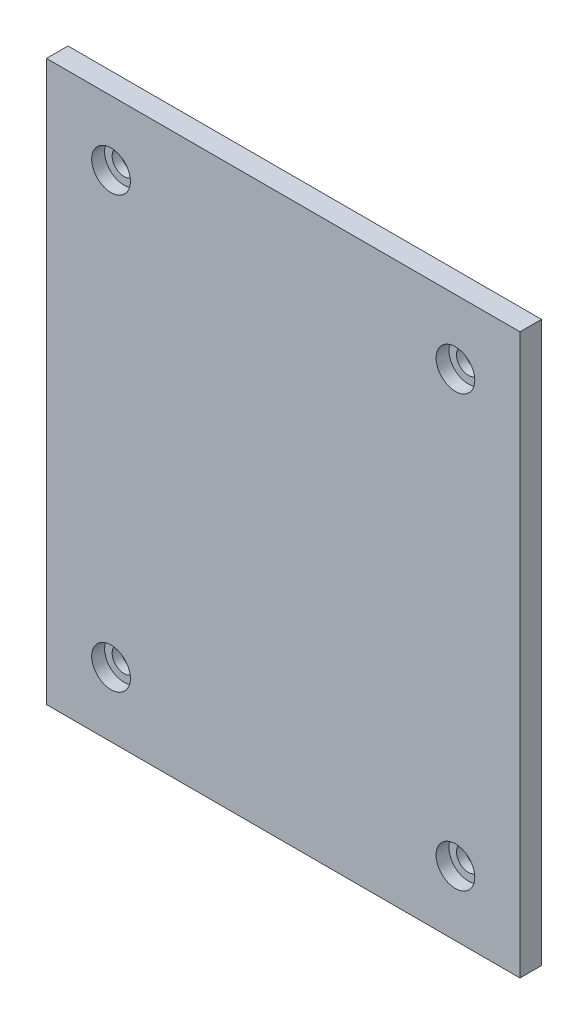
ISO-10303-21;
HEADER;
FILE_DESCRIPTION(('STEP AP214'),'2;1');
FILE_NAME('part.step','',(''),(''),'','','');
FILE_SCHEMA(('AUTOMOTIVE_DESIGN { 1 0 10303 214 1 1 1 1 }'));
ENDSEC;
DATA;
#1=APPLICATION_CONTEXT('core data for automotive mechanical design processes');
#2=APPLICATION_PROTOCOL_DEFINITION('international standard','automotive_design',2000,#1);
#3=PRODUCT_CONTEXT('',#1,'mechanical');
#4=PRODUCT('Part','Part','',(#3));
#5=PRODUCT_RELATED_PRODUCT_CATEGORY('part','',(#4));
#6=PRODUCT_DEFINITION_FORMATION('','',#4);
#7=PRODUCT_DEFINITION_CONTEXT('part definition',#1,'design');
#8=PRODUCT_DEFINITION('design','',#6,#7);
#9=PRODUCT_DEFINITION_SHAPE('','',#8);
#10=(LENGTH_UNIT() NAMED_UNIT(*) SI_UNIT(.MILLI.,.METRE.));
#11=(NAMED_UNIT(*) PLANE_ANGLE_UNIT() SI_UNIT($,.RADIAN.));
#12=(NAMED_UNIT(*) SI_UNIT($,.STERADIAN.) SOLID_ANGLE_UNIT());
#13=UNCERTAINTY_MEASURE_WITH_UNIT(LENGTH_MEASURE(1.E-05),#10,'distance_accuracy_value','');
#14=(GEOMETRIC_REPRESENTATION_CONTEXT(3) GLOBAL_UNCERTAINTY_ASSIGNED_CONTEXT((#13)) GLOBAL_UNIT_ASSIGNED_CONTEXT((#10,
#11,#12)) REPRESENTATION_CONTEXT('',''));
#15=CARTESIAN_POINT('',(0.,0.,0.));
#16=DIRECTION('',(0.,0.,1.));
#17=DIRECTION('',(1.,0.,0.));
#18=AXIS2_PLACEMENT_3D('',#15,#16,#17);
#19=CARTESIAN_POINT('',(-40.,50.,0.));
#20=DIRECTION('',(0.,0.,1.));
#21=DIRECTION('',(1.,0.,0.));
#22=AXIS2_PLACEMENT_3D('',#19,#20,#21);
#23=CYLINDRICAL_SURFACE('',#22,2.75);
#24=CARTESIAN_POINT('',(-40.,50.,0.));
#25=DIRECTION('',(0.,0.,1.));
#26=DIRECTION('',(1.,0.,0.));
#27=AXIS2_PLACEMENT_3D('',#24,#25,#26);
#28=CIRCLE('',#27,2.75);
#29=CARTESIAN_POINT('',(-37.25,50.,0.));
#30=VERTEX_POINT('',#29);
#31=EDGE_CURVE('E108',#30,#30,#28,.T.);
#32=ORIENTED_EDGE('',*,*,#31,.F.);
#33=EDGE_LOOP('',(#32));
#34=FACE_BOUND('',#33,.T.);
#35=CARTESIAN_POINT('',(-40.,50.,2.));
#36=DIRECTION('',(0.,0.,1.));
#37=DIRECTION('',(1.,0.,0.));
#38=AXIS2_PLACEMENT_3D('',#35,#36,#37);
#39=CIRCLE('',#38,2.75);
#40=CARTESIAN_POINT('',(-37.25,50.,2.));
#41=VERTEX_POINT('',#40);
#42=EDGE_CURVE('E43',#41,#41,#39,.F.);
#43=ORIENTED_EDGE('',*,*,#42,.F.);
#44=EDGE_LOOP('',(#43));
#45=FACE_BOUND('',#44,.T.);
#46=ADVANCED_FACE('F39',(#34,#45),#23,.F.);
#47=CARTESIAN_POINT('',(40.,-50.,0.));
#48=DIRECTION('',(0.,0.,1.));
#49=DIRECTION('',(1.,0.,0.));
#50=AXIS2_PLACEMENT_3D('',#47,#48,#49);
#51=CYLINDRICAL_SURFACE('',#50,2.75);
#52=CARTESIAN_POINT('',(40.,-50.,0.));
#53=DIRECTION('',(0.,0.,1.));
#54=DIRECTION('',(1.,0.,0.));
#55=AXIS2_PLACEMENT_3D('',#52,#53,#54);
#56=CIRCLE('',#55,2.75);
#57=CARTESIAN_POINT('',(42.75,-50.,0.));
#58=VERTEX_POINT('',#57);
#59=EDGE_CURVE('E133',#58,#58,#56,.T.);
#60=ORIENTED_EDGE('',*,*,#59,.F.);
#61=EDGE_LOOP('',(#60));
#62=FACE_BOUND('',#61,.T.);
#63=CARTESIAN_POINT('',(40.,-50.,2.));
#64=DIRECTION('',(0.,0.,1.));
#65=DIRECTION('',(1.,0.,0.));
#66=AXIS2_PLACEMENT_3D('',#63,#64,#65);
#67=CIRCLE('',#66,2.75);
#68=CARTESIAN_POINT('',(42.75,-50.,2.));
#69=VERTEX_POINT('',#68);
#70=EDGE_CURVE('E121',#69,#69,#67,.F.);
#71=ORIENTED_EDGE('',*,*,#70,.F.);
#72=EDGE_LOOP('',(#71));
#73=FACE_BOUND('',#72,.T.);
#74=ADVANCED_FACE('F193',(#62,#73),#51,.F.);
#75=CARTESIAN_POINT('',(-40.,-50.,0.));
#76=DIRECTION('',(0.,0.,1.));
#77=DIRECTION('',(1.,0.,0.));
#78=AXIS2_PLACEMENT_3D('',#75,#76,#77);
#79=CYLINDRICAL_SURFACE('',#78,2.75);
#80=CARTESIAN_POINT('',(-40.,-50.,0.));
#81=DIRECTION('',(0.,0.,1.));
#82=DIRECTION('',(1.,0.,0.));
#83=AXIS2_PLACEMENT_3D('',#80,#81,#82);
#84=CIRCLE('',#83,2.75);
#85=CARTESIAN_POINT('',(-37.25,-50.,0.));
#86=VERTEX_POINT('',#85);
#87=EDGE_CURVE('E128',#86,#86,#84,.T.);
#88=ORIENTED_EDGE('',*,*,#87,.F.);
#89=EDGE_LOOP('',(#88));
#90=FACE_BOUND('',#89,.T.);
#91=CARTESIAN_POINT('',(-40.,-50.,2.));
#92=DIRECTION('',(0.,0.,1.));
#93=DIRECTION('',(1.,0.,0.));
#94=AXIS2_PLACEMENT_3D('',#91,#92,#93);
#95=CIRCLE('',#94,2.75);
#96=CARTESIAN_POINT('',(-37.25,-50.,2.));
#97=VERTEX_POINT('',#96);
#98=EDGE_CURVE('E119',#97,#97,#95,.F.);
#99=ORIENTED_EDGE('',*,*,#98,.F.);
#100=EDGE_LOOP('',(#99));
#101=FACE_BOUND('',#100,.T.);
#102=ADVANCED_FACE('F203',(#90,#101),#79,.F.);
#103=CARTESIAN_POINT('',(40.,50.,0.));
#104=DIRECTION('',(0.,0.,1.));
#105=DIRECTION('',(1.,0.,0.));
#106=AXIS2_PLACEMENT_3D('',#103,#104,#105);
#107=CYLINDRICAL_SURFACE('',#106,2.75);
#108=CARTESIAN_POINT('',(40.,50.,0.));
#109=DIRECTION('',(0.,0.,1.));
#110=DIRECTION('',(1.,0.,0.));
#111=AXIS2_PLACEMENT_3D('',#108,#109,#110);
#112=CIRCLE('',#111,2.75);
#113=CARTESIAN_POINT('',(42.75,50.,0.));
#114=VERTEX_POINT('',#113);
#115=EDGE_CURVE('E127',#114,#114,#112,.T.);
#116=ORIENTED_EDGE('',*,*,#115,.F.);
#117=EDGE_LOOP('',(#116));
#118=FACE_BOUND('',#117,.T.);
#119=CARTESIAN_POINT('',(40.,50.,2.));
#120=DIRECTION('',(0.,0.,1.));
#121=DIRECTION('',(1.,0.,0.));
#122=AXIS2_PLACEMENT_3D('',#119,#120,#121);
#123=CIRCLE('',#122,2.75);
#124=CARTESIAN_POINT('',(42.75,50.,2.));
#125=VERTEX_POINT('',#124);
#126=EDGE_CURVE('E113',#125,#125,#123,.F.);
#127=ORIENTED_EDGE('',*,*,#126,.F.);
#128=EDGE_LOOP('',(#127));
#129=FACE_BOUND('',#128,.T.);
#130=ADVANCED_FACE('F202',(#118,#129),#107,.F.);
#131=CARTESIAN_POINT('',(-55.,-65.,5.));
#132=DIRECTION('',(0.,1.,0.));
#133=DIRECTION('',(-1.,0.,0.));
#134=AXIS2_PLACEMENT_3D('',#131,#132,#133);
#135=PLANE('',#134);
#136=DIRECTION('',(1.,0.,0.));
#137=VECTOR('',#136,1.);
#138=CARTESIAN_POINT('',(-55.,-65.,0.));
#139=LINE('',#138,#137);
#140=CARTESIAN_POINT('',(-55.,-65.,0.));
#141=VERTEX_POINT('',#140);
#142=CARTESIAN_POINT('',(55.,-65.,0.));
#143=VERTEX_POINT('',#142);
#144=EDGE_CURVE('E106',#141,#143,#139,.T.);
#145=ORIENTED_EDGE('',*,*,#144,.T.);
#146=DIRECTION('',(0.,0.,-1.));
#147=VECTOR('',#146,1.);
#148=CARTESIAN_POINT('',(55.,-65.,5.));
#149=LINE('',#148,#147);
#150=CARTESIAN_POINT('',(55.,-65.,5.));
#151=VERTEX_POINT('',#150);
#152=EDGE_CURVE('E11',#151,#143,#149,.T.);
#153=ORIENTED_EDGE('',*,*,#152,.F.);
#154=DIRECTION('',(1.,0.,0.));
#155=VECTOR('',#154,1.);
#156=CARTESIAN_POINT('',(-55.,-65.,5.));
#157=LINE('',#156,#155);
#158=CARTESIAN_POINT('',(-55.,-65.,5.));
#159=VERTEX_POINT('',#158);
#160=EDGE_CURVE('E91',#159,#151,#157,.T.);
#161=ORIENTED_EDGE('',*,*,#160,.F.);
#162=DIRECTION('',(0.,0.,-1.));
#163=VECTOR('',#162,1.);
#164=CARTESIAN_POINT('',(-55.,-65.,5.));
#165=LINE('',#164,#163);
#166=EDGE_CURVE('E105',#159,#141,#165,.T.);
#167=ORIENTED_EDGE('',*,*,#166,.T.);
#168=EDGE_LOOP('',(#145,#153,#161,#167));
#169=FACE_BOUND('',#168,.T.);
#170=ADVANCED_FACE('F41',(#169),#135,.F.);
#171=CARTESIAN_POINT('',(55.,65.,5.));
#172=DIRECTION('',(-1.,0.,0.));
#173=DIRECTION('',(0.,-1.,0.));
#174=AXIS2_PLACEMENT_3D('',#171,#172,#173);
#175=PLANE('',#174);
#176=DIRECTION('',(0.,1.,0.));
#177=VECTOR('',#176,1.);
#178=CARTESIAN_POINT('',(55.,65.,0.));
#179=LINE('',#178,#177);
#180=CARTESIAN_POINT('',(55.,65.,0.));
#181=VERTEX_POINT('',#180);
#182=EDGE_CURVE('E100',#143,#181,#179,.T.);
#183=ORIENTED_EDGE('',*,*,#182,.T.);
#184=DIRECTION('',(0.,0.,-1.));
#185=VECTOR('',#184,1.);
#186=CARTESIAN_POINT('',(55.,65.,5.));
#187=LINE('',#186,#185);
#188=CARTESIAN_POINT('',(55.,65.,5.));
#189=VERTEX_POINT('',#188);
#190=EDGE_CURVE('E47',#189,#181,#187,.T.);
#191=ORIENTED_EDGE('',*,*,#190,.F.);
#192=DIRECTION('',(0.,1.,0.));
#193=VECTOR('',#192,1.);
#194=CARTESIAN_POINT('',(55.,65.,5.));
#195=LINE('',#194,#193);
#196=EDGE_CURVE('E86',#151,#189,#195,.T.);
#197=ORIENTED_EDGE('',*,*,#196,.F.);
#198=ORIENTED_EDGE('',*,*,#152,.T.);
#199=EDGE_LOOP('',(#183,#191,#197,#198));
#200=FACE_BOUND('',#199,.T.);
#201=ADVANCED_FACE('F96',(#200),#175,.F.);
#202=CARTESIAN_POINT('',(-55.,65.,5.));
#203=DIRECTION('',(0.,-1.,0.));
#204=DIRECTION('',(0.,0.,-1.));
#205=AXIS2_PLACEMENT_3D('',#202,#203,#204);
#206=PLANE('',#205);
#207=DIRECTION('',(-1.,0.,0.));
#208=VECTOR('',#207,1.);
#209=CARTESIAN_POINT('',(-55.,65.,0.));
#210=LINE('',#209,#208);
#211=CARTESIAN_POINT('',(-55.,65.,0.));
#212=VERTEX_POINT('',#211);
#213=EDGE_CURVE('E73',#181,#212,#210,.T.);
#214=ORIENTED_EDGE('',*,*,#213,.T.);
#215=DIRECTION('',(0.,0.,-1.));
#216=VECTOR('',#215,1.);
#217=CARTESIAN_POINT('',(-55.,65.,5.));
#218=LINE('',#217,#216);
#219=CARTESIAN_POINT('',(-55.,65.,5.));
#220=VERTEX_POINT('',#219);
#221=EDGE_CURVE('E98',#220,#212,#218,.T.);
#222=ORIENTED_EDGE('',*,*,#221,.F.);
#223=DIRECTION('',(-1.,0.,0.));
#224=VECTOR('',#223,1.);
#225=CARTESIAN_POINT('',(-55.,65.,5.));
#226=LINE('',#225,#224);
#227=EDGE_CURVE('E93',#189,#220,#226,.T.);
#228=ORIENTED_EDGE('',*,*,#227,.F.);
#229=ORIENTED_EDGE('',*,*,#190,.T.);
#230=EDGE_LOOP('',(#214,#222,#228,#229));
#231=FACE_BOUND('',#230,.T.);
#232=ADVANCED_FACE('F99',(#231),#206,.F.);
#233=CARTESIAN_POINT('',(-55.,65.,5.));
#234=DIRECTION('',(1.,0.,0.));
#235=DIRECTION('',(0.,1.,0.));
#236=AXIS2_PLACEMENT_3D('',#233,#234,#235);
#237=PLANE('',#236);
#238=DIRECTION('',(0.,-1.,0.));
#239=VECTOR('',#238,1.);
#240=CARTESIAN_POINT('',(-55.,65.,0.));
#241=LINE('',#240,#239);
#242=EDGE_CURVE('E81',#212,#141,#241,.T.);
#243=ORIENTED_EDGE('',*,*,#242,.T.);
#244=ORIENTED_EDGE('',*,*,#166,.F.);
#245=DIRECTION('',(0.,-1.,0.));
#246=VECTOR('',#245,1.);
#247=CARTESIAN_POINT('',(-55.,65.,5.));
#248=LINE('',#247,#246);
#249=EDGE_CURVE('E59',#220,#159,#248,.T.);
#250=ORIENTED_EDGE('',*,*,#249,.F.);
#251=ORIENTED_EDGE('',*,*,#221,.T.);
#252=EDGE_LOOP('',(#243,#244,#250,#251));
#253=FACE_BOUND('',#252,.T.);
#254=ADVANCED_FACE('F173',(#253),#237,.F.);
#255=CARTESIAN_POINT('',(0.,0.,5.));
#256=DIRECTION('',(0.,0.,-1.));
#257=DIRECTION('',(-1.,0.,0.));
#258=AXIS2_PLACEMENT_3D('',#255,#256,#257);
#259=PLANE('',#258);
#260=CARTESIAN_POINT('',(-40.,-50.,5.));
#261=DIRECTION('',(0.,0.,1.));
#262=DIRECTION('',(1.,0.,0.));
#263=AXIS2_PLACEMENT_3D('',#260,#261,#262);
#264=CIRCLE('',#263,4.5);
#265=CARTESIAN_POINT('',(-35.5,-50.,5.));
#266=VERTEX_POINT('',#265);
#267=EDGE_CURVE('E154',#266,#266,#264,.T.);
#268=ORIENTED_EDGE('',*,*,#267,.F.);
#269=EDGE_LOOP('',(#268));
#270=FACE_BOUND('',#269,.T.);
#271=CARTESIAN_POINT('',(40.,-50.,5.));
#272=DIRECTION('',(0.,0.,1.));
#273=DIRECTION('',(1.,0.,0.));
#274=AXIS2_PLACEMENT_3D('',#271,#272,#273);
#275=CIRCLE('',#274,4.5);
#276=CARTESIAN_POINT('',(44.5,-50.,5.));
#277=VERTEX_POINT('',#276);
#278=EDGE_CURVE('E161',#277,#277,#275,.T.);
#279=ORIENTED_EDGE('',*,*,#278,.F.);
#280=EDGE_LOOP('',(#279));
#281=FACE_BOUND('',#280,.T.);
#282=CARTESIAN_POINT('',(40.,50.,5.));
#283=DIRECTION('',(0.,0.,1.));
#284=DIRECTION('',(1.,0.,0.));
#285=AXIS2_PLACEMENT_3D('',#282,#283,#284);
#286=CIRCLE('',#285,4.5);
#287=CARTESIAN_POINT('',(44.5,50.,5.));
#288=VERTEX_POINT('',#287);
#289=EDGE_CURVE('E149',#288,#288,#286,.T.);
#290=ORIENTED_EDGE('',*,*,#289,.F.);
#291=EDGE_LOOP('',(#290));
#292=FACE_BOUND('',#291,.T.);
#293=CARTESIAN_POINT('',(-40.,50.,5.));
#294=DIRECTION('',(0.,0.,1.));
#295=DIRECTION('',(1.,0.,0.));
#296=AXIS2_PLACEMENT_3D('',#293,#294,#295);
#297=CIRCLE('',#296,4.5);
#298=CARTESIAN_POINT('',(-35.5,50.,5.));
#299=VERTEX_POINT('',#298);
#300=EDGE_CURVE('E148',#299,#299,#297,.T.);
#301=ORIENTED_EDGE('',*,*,#300,.F.);
#302=EDGE_LOOP('',(#301));
#303=FACE_BOUND('',#302,.T.);
#304=ORIENTED_EDGE('',*,*,#160,.T.);
#305=ORIENTED_EDGE('',*,*,#196,.T.);
#306=ORIENTED_EDGE('',*,*,#227,.T.);
#307=ORIENTED_EDGE('',*,*,#249,.T.);
#308=EDGE_LOOP('',(#304,#305,#306,#307));
#309=FACE_BOUND('',#308,.T.);
#310=ADVANCED_FACE('F90',(#270,#281,#292,#303,#309),#259,.F.);
#311=CARTESIAN_POINT('',(0.,0.,0.));
#312=DIRECTION('',(0.,0.,-1.));
#313=DIRECTION('',(-1.,0.,0.));
#314=AXIS2_PLACEMENT_3D('',#311,#312,#313);
#315=PLANE('',#314);
#316=ORIENTED_EDGE('',*,*,#115,.T.);
#317=EDGE_LOOP('',(#316));
#318=FACE_BOUND('',#317,.T.);
#319=ORIENTED_EDGE('',*,*,#87,.T.);
#320=EDGE_LOOP('',(#319));
#321=FACE_BOUND('',#320,.T.);
#322=ORIENTED_EDGE('',*,*,#59,.T.);
#323=EDGE_LOOP('',(#322));
#324=FACE_BOUND('',#323,.T.);
#325=ORIENTED_EDGE('',*,*,#31,.T.);
#326=EDGE_LOOP('',(#325));
#327=FACE_BOUND('',#326,.T.);
#328=ORIENTED_EDGE('',*,*,#144,.F.);
#329=ORIENTED_EDGE('',*,*,#242,.F.);
#330=ORIENTED_EDGE('',*,*,#213,.F.);
#331=ORIENTED_EDGE('',*,*,#182,.F.);
#332=EDGE_LOOP('',(#328,#329,#330,#331));
#333=FACE_BOUND('',#332,.T.);
#334=ADVANCED_FACE('F171',(#318,#321,#324,#327,#333),#315,.T.);
#335=CARTESIAN_POINT('',(40.,50.,2.));
#336=DIRECTION('',(0.,0.,1.));
#337=DIRECTION('',(1.,0.,0.));
#338=AXIS2_PLACEMENT_3D('',#335,#336,#337);
#339=PLANE('',#338);
#340=CARTESIAN_POINT('',(40.,50.,2.));
#341=DIRECTION('',(0.,0.,1.));
#342=DIRECTION('',(1.,0.,0.));
#343=AXIS2_PLACEMENT_3D('',#340,#341,#342);
#344=CIRCLE('',#343,4.5);
#345=CARTESIAN_POINT('',(44.5,50.,2.));
#346=VERTEX_POINT('',#345);
#347=EDGE_CURVE('E163',#346,#346,#344,.T.);
#348=ORIENTED_EDGE('',*,*,#347,.T.);
#349=EDGE_LOOP('',(#348));
#350=FACE_BOUND('',#349,.T.);
#351=ORIENTED_EDGE('',*,*,#126,.T.);
#352=EDGE_LOOP('',(#351));
#353=FACE_BOUND('',#352,.T.);
#354=ADVANCED_FACE('F207',(#350,#353),#339,.T.);
#355=CARTESIAN_POINT('',(40.,50.,2.));
#356=DIRECTION('',(0.,0.,1.));
#357=DIRECTION('',(1.,0.,0.));
#358=AXIS2_PLACEMENT_3D('',#355,#356,#357);
#359=CYLINDRICAL_SURFACE('',#358,4.5);
#360=ORIENTED_EDGE('',*,*,#347,.F.);
#361=EDGE_LOOP('',(#360));
#362=FACE_BOUND('',#361,.T.);
#363=ORIENTED_EDGE('',*,*,#289,.T.);
#364=EDGE_LOOP('',(#363));
#365=FACE_BOUND('',#364,.T.);
#366=ADVANCED_FACE('F168',(#362,#365),#359,.F.);
#367=CARTESIAN_POINT('',(-40.,-50.,2.));
#368=DIRECTION('',(0.,0.,1.));
#369=DIRECTION('',(1.,0.,0.));
#370=AXIS2_PLACEMENT_3D('',#367,#368,#369);
#371=PLANE('',#370);
#372=CARTESIAN_POINT('',(-40.,-50.,2.));
#373=DIRECTION('',(0.,0.,1.));
#374=DIRECTION('',(1.,0.,0.));
#375=AXIS2_PLACEMENT_3D('',#372,#373,#374);
#376=CIRCLE('',#375,4.5);
#377=CARTESIAN_POINT('',(-35.5,-50.,2.));
#378=VERTEX_POINT('',#377);
#379=EDGE_CURVE('E155',#378,#378,#376,.T.);
#380=ORIENTED_EDGE('',*,*,#379,.T.);
#381=EDGE_LOOP('',(#380));
#382=FACE_BOUND('',#381,.T.);
#383=ORIENTED_EDGE('',*,*,#98,.T.);
#384=EDGE_LOOP('',(#383));
#385=FACE_BOUND('',#384,.T.);
#386=ADVANCED_FACE('F240',(#382,#385),#371,.T.);
#387=CARTESIAN_POINT('',(-40.,-50.,2.));
#388=DIRECTION('',(0.,0.,1.));
#389=DIRECTION('',(1.,0.,0.));
#390=AXIS2_PLACEMENT_3D('',#387,#388,#389);
#391=CYLINDRICAL_SURFACE('',#390,4.5);
#392=ORIENTED_EDGE('',*,*,#379,.F.);
#393=EDGE_LOOP('',(#392));
#394=FACE_BOUND('',#393,.T.);
#395=ORIENTED_EDGE('',*,*,#267,.T.);
#396=EDGE_LOOP('',(#395));
#397=FACE_BOUND('',#396,.T.);
#398=ADVANCED_FACE('F250',(#394,#397),#391,.F.);
#399=CARTESIAN_POINT('',(40.,-50.,2.));
#400=DIRECTION('',(0.,0.,1.));
#401=DIRECTION('',(1.,0.,0.));
#402=AXIS2_PLACEMENT_3D('',#399,#400,#401);
#403=PLANE('',#402);
#404=CARTESIAN_POINT('',(40.,-50.,2.));
#405=DIRECTION('',(0.,0.,1.));
#406=DIRECTION('',(1.,0.,0.));
#407=AXIS2_PLACEMENT_3D('',#404,#405,#406);
#408=CIRCLE('',#407,4.5);
#409=CARTESIAN_POINT('',(44.5,-50.,2.));
#410=VERTEX_POINT('',#409);
#411=EDGE_CURVE('E158',#410,#410,#408,.T.);
#412=ORIENTED_EDGE('',*,*,#411,.T.);
#413=EDGE_LOOP('',(#412));
#414=FACE_BOUND('',#413,.T.);
#415=ORIENTED_EDGE('',*,*,#70,.T.);
#416=EDGE_LOOP('',(#415));
#417=FACE_BOUND('',#416,.T.);
#418=ADVANCED_FACE('F244',(#414,#417),#403,.T.);
#419=CARTESIAN_POINT('',(40.,-50.,2.));
#420=DIRECTION('',(0.,0.,1.));
#421=DIRECTION('',(1.,0.,0.));
#422=AXIS2_PLACEMENT_3D('',#419,#420,#421);
#423=CYLINDRICAL_SURFACE('',#422,4.5);
#424=ORIENTED_EDGE('',*,*,#411,.F.);
#425=EDGE_LOOP('',(#424));
#426=FACE_BOUND('',#425,.T.);
#427=ORIENTED_EDGE('',*,*,#278,.T.);
#428=EDGE_LOOP('',(#427));
#429=FACE_BOUND('',#428,.T.);
#430=ADVANCED_FACE('F189',(#426,#429),#423,.F.);
#431=CARTESIAN_POINT('',(-40.,50.,2.));
#432=DIRECTION('',(0.,0.,1.));
#433=DIRECTION('',(1.,0.,0.));
#434=AXIS2_PLACEMENT_3D('',#431,#432,#433);
#435=PLANE('',#434);
#436=CARTESIAN_POINT('',(-40.,50.,2.));
#437=DIRECTION('',(0.,0.,1.));
#438=DIRECTION('',(1.,0.,0.));
#439=AXIS2_PLACEMENT_3D('',#436,#437,#438);
#440=CIRCLE('',#439,4.5);
#441=CARTESIAN_POINT('',(-35.5,50.,2.));
#442=VERTEX_POINT('',#441);
#443=EDGE_CURVE('E116',#442,#442,#440,.T.);
#444=ORIENTED_EDGE('',*,*,#443,.T.);
#445=EDGE_LOOP('',(#444));
#446=FACE_BOUND('',#445,.T.);
#447=ORIENTED_EDGE('',*,*,#42,.T.);
#448=EDGE_LOOP('',(#447));
#449=FACE_BOUND('',#448,.T.);
#450=ADVANCED_FACE('F185',(#446,#449),#435,.T.);
#451=CARTESIAN_POINT('',(-40.,50.,2.));
#452=DIRECTION('',(0.,0.,1.));
#453=DIRECTION('',(1.,0.,0.));
#454=AXIS2_PLACEMENT_3D('',#451,#452,#453);
#455=CYLINDRICAL_SURFACE('',#454,4.5);
#456=ORIENTED_EDGE('',*,*,#443,.F.);
#457=EDGE_LOOP('',(#456));
#458=FACE_BOUND('',#457,.T.);
#459=ORIENTED_EDGE('',*,*,#300,.T.);
#460=EDGE_LOOP('',(#459));
#461=FACE_BOUND('',#460,.T.);
#462=ADVANCED_FACE('F179',(#458,#461),#455,.F.);
#463=CLOSED_SHELL('',(#46,#74,#102,#130,#170,#201,#232,#254,#310,#334,#354,#366,#386,#398,#418,
#430,#450,#462));
#464=MANIFOLD_SOLID_BREP('B2',#463);
#465=ADVANCED_BREP_SHAPE_REPRESENTATION('',(#18,#464),#14);
#466=SHAPE_DEFINITION_REPRESENTATION(#9,#465);
ENDSEC;
END-ISO-10303-21;
